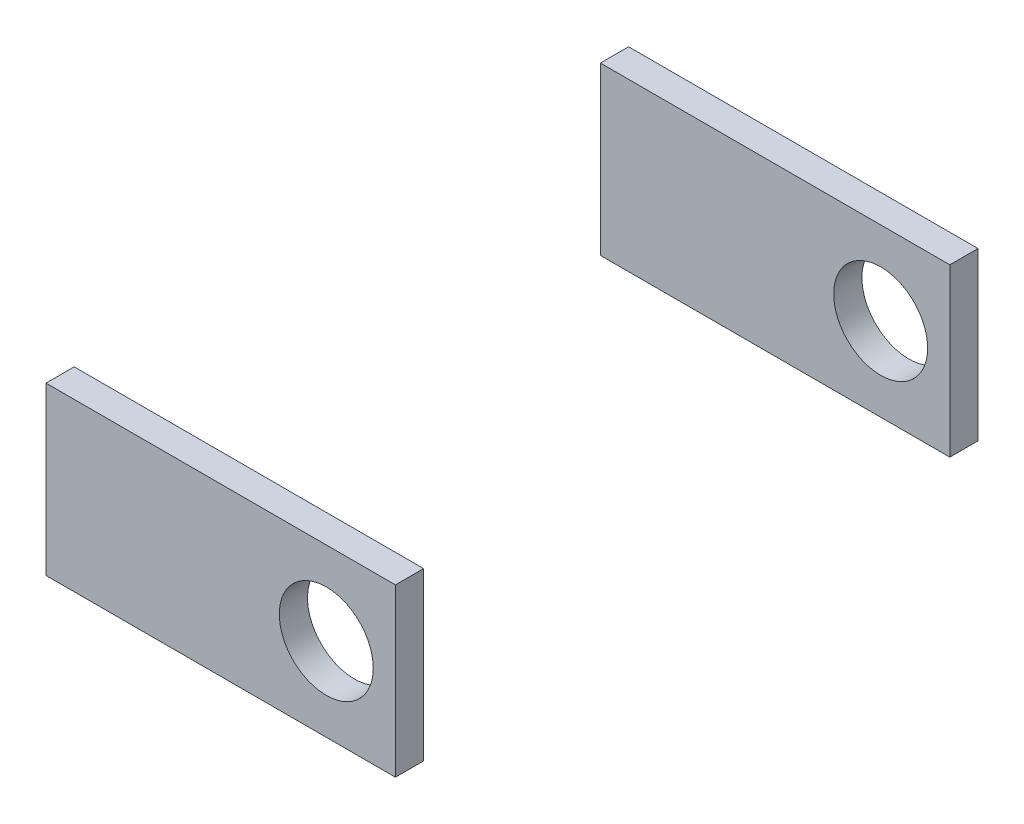
ISO-10303-21;
HEADER;
FILE_DESCRIPTION(('STEP AP214'),'2;1');
FILE_NAME('part.step','',(''),(''),'','','');
FILE_SCHEMA(('AUTOMOTIVE_DESIGN { 1 0 10303 214 1 1 1 1 }'));
ENDSEC;
DATA;
#1=APPLICATION_CONTEXT('core data for automotive mechanical design processes');
#2=APPLICATION_PROTOCOL_DEFINITION('international standard','automotive_design',2000,#1);
#3=PRODUCT_CONTEXT('',#1,'mechanical');
#4=PRODUCT('Part','Part','',(#3));
#5=PRODUCT_RELATED_PRODUCT_CATEGORY('part','',(#4));
#6=PRODUCT_DEFINITION_FORMATION('','',#4);
#7=PRODUCT_DEFINITION_CONTEXT('part definition',#1,'design');
#8=PRODUCT_DEFINITION('design','',#6,#7);
#9=PRODUCT_DEFINITION_SHAPE('','',#8);
#10=(LENGTH_UNIT() NAMED_UNIT(*) SI_UNIT(.MILLI.,.METRE.));
#11=(NAMED_UNIT(*) PLANE_ANGLE_UNIT() SI_UNIT($,.RADIAN.));
#12=(NAMED_UNIT(*) SI_UNIT($,.STERADIAN.) SOLID_ANGLE_UNIT());
#13=UNCERTAINTY_MEASURE_WITH_UNIT(LENGTH_MEASURE(1.E-05),#10,'distance_accuracy_value','');
#14=(GEOMETRIC_REPRESENTATION_CONTEXT(3) GLOBAL_UNCERTAINTY_ASSIGNED_CONTEXT((#13)) GLOBAL_UNIT_ASSIGNED_CONTEXT((#10,
#11,#12)) REPRESENTATION_CONTEXT('',''));
#15=CARTESIAN_POINT('',(0.,0.,0.));
#16=DIRECTION('',(0.,0.,1.));
#17=DIRECTION('',(1.,0.,0.));
#18=AXIS2_PLACEMENT_3D('',#15,#16,#17);
#19=CARTESIAN_POINT('',(40.,8.865220704011,70.2));
#20=DIRECTION('',(0.,1.,0.));
#21=DIRECTION('',(-1.,0.,0.));
#22=AXIS2_PLACEMENT_3D('',#19,#20,#21);
#23=PLANE('',#22);
#24=DIRECTION('',(-1.,0.,0.));
#25=VECTOR('',#24,1.);
#26=CARTESIAN_POINT('',(40.,8.86522070401099,70.2));
#27=LINE('',#26,#25);
#28=CARTESIAN_POINT('',(40.,8.865220704011,70.2));
#29=VERTEX_POINT('',#28);
#30=CARTESIAN_POINT('',(2.81236982140303,8.86522070401099,70.2));
#31=VERTEX_POINT('',#30);
#32=EDGE_CURVE('E94',#29,#31,#27,.T.);
#33=ORIENTED_EDGE('',*,*,#32,.T.);
#34=DIRECTION('',(0.,0.,1.));
#35=VECTOR('',#34,1.);
#36=CARTESIAN_POINT('',(2.81236982140303,8.86522070401099,0.));
#37=LINE('',#36,#35);
#38=CARTESIAN_POINT('',(2.81236982140303,8.86522070401099,73.2));
#39=VERTEX_POINT('',#38);
#40=EDGE_CURVE('E56',#31,#39,#37,.T.);
#41=ORIENTED_EDGE('',*,*,#40,.T.);
#42=DIRECTION('',(-1.,0.,0.));
#43=VECTOR('',#42,1.);
#44=CARTESIAN_POINT('',(40.,8.865220704011,73.2));
#45=LINE('',#44,#43);
#46=CARTESIAN_POINT('',(40.,8.865220704011,73.2));
#47=VERTEX_POINT('',#46);
#48=EDGE_CURVE('E61',#47,#39,#45,.T.);
#49=ORIENTED_EDGE('',*,*,#48,.F.);
#50=DIRECTION('',(0.,0.,1.));
#51=VECTOR('',#50,1.);
#52=CARTESIAN_POINT('',(40.,8.865220704011,70.2));
#53=LINE('',#52,#51);
#54=EDGE_CURVE('E120',#29,#47,#53,.T.);
#55=ORIENTED_EDGE('',*,*,#54,.F.);
#56=EDGE_LOOP('',(#33,#41,#49,#55));
#57=FACE_BOUND('',#56,.T.);
#58=ADVANCED_FACE('F53',(#57),#23,.T.);
#59=CARTESIAN_POINT('',(0.,-8.86522070401099,70.2));
#60=DIRECTION('',(0.,-1.,0.));
#61=DIRECTION('',(1.,0.,0.));
#62=AXIS2_PLACEMENT_3D('',#59,#60,#61);
#63=PLANE('',#62);
#64=DIRECTION('',(0.,0.,1.));
#65=VECTOR('',#64,1.);
#66=CARTESIAN_POINT('',(2.81236982140303,-8.86522070401099,0.));
#67=LINE('',#66,#65);
#68=CARTESIAN_POINT('',(2.81236982140303,-8.86522070401099,70.2));
#69=VERTEX_POINT('',#68);
#70=CARTESIAN_POINT('',(2.81236982140303,-8.86522070401099,73.2));
#71=VERTEX_POINT('',#70);
#72=EDGE_CURVE('E107',#69,#71,#67,.T.);
#73=ORIENTED_EDGE('',*,*,#72,.F.);
#74=DIRECTION('',(1.,0.,0.));
#75=VECTOR('',#74,1.);
#76=CARTESIAN_POINT('',(0.,-8.86522070401099,70.2));
#77=LINE('',#76,#75);
#78=CARTESIAN_POINT('',(40.,-8.865220704011,70.2));
#79=VERTEX_POINT('',#78);
#80=EDGE_CURVE('E73',#69,#79,#77,.T.);
#81=ORIENTED_EDGE('',*,*,#80,.T.);
#82=DIRECTION('',(0.,0.,1.));
#83=VECTOR('',#82,1.);
#84=CARTESIAN_POINT('',(40.,-8.865220704011,70.2));
#85=LINE('',#84,#83);
#86=CARTESIAN_POINT('',(40.,-8.865220704011,73.2));
#87=VERTEX_POINT('',#86);
#88=EDGE_CURVE('E114',#79,#87,#85,.T.);
#89=ORIENTED_EDGE('',*,*,#88,.T.);
#90=DIRECTION('',(1.,0.,0.));
#91=VECTOR('',#90,1.);
#92=CARTESIAN_POINT('',(0.,-8.86522070401099,73.2));
#93=LINE('',#92,#91);
#94=EDGE_CURVE('E119',#71,#87,#93,.T.);
#95=ORIENTED_EDGE('',*,*,#94,.F.);
#96=EDGE_LOOP('',(#73,#81,#89,#95));
#97=FACE_BOUND('',#96,.T.);
#98=ADVANCED_FACE('F131',(#97),#63,.T.);
#99=CARTESIAN_POINT('',(2.81236982140303,0.,0.));
#100=DIRECTION('',(1.,0.,0.));
#101=DIRECTION('',(0.,1.,0.));
#102=AXIS2_PLACEMENT_3D('',#99,#100,#101);
#103=PLANE('',#102);
#104=ORIENTED_EDGE('',*,*,#40,.F.);
#105=DIRECTION('',(0.,1.,0.));
#106=VECTOR('',#105,1.);
#107=CARTESIAN_POINT('',(2.81236982140303,-8.86522070401099,70.2));
#108=LINE('',#107,#106);
#109=EDGE_CURVE('E12',#69,#31,#108,.T.);
#110=ORIENTED_EDGE('',*,*,#109,.F.);
#111=ORIENTED_EDGE('',*,*,#72,.T.);
#112=DIRECTION('',(0.,1.,0.));
#113=VECTOR('',#112,1.);
#114=CARTESIAN_POINT('',(2.81236982140303,0.,73.2));
#115=LINE('',#114,#113);
#116=EDGE_CURVE('E101',#71,#39,#115,.T.);
#117=ORIENTED_EDGE('',*,*,#116,.T.);
#118=EDGE_LOOP('',(#104,#110,#111,#117));
#119=FACE_BOUND('',#118,.T.);
#120=ADVANCED_FACE('F105',(#119),#103,.F.);
#121=CARTESIAN_POINT('',(32.6400394511442,0.,70.2));
#122=DIRECTION('',(0.,0.,1.));
#123=DIRECTION('',(1.,0.,0.));
#124=AXIS2_PLACEMENT_3D('',#121,#122,#123);
#125=CYLINDRICAL_SURFACE('',#124,5.);
#126=CARTESIAN_POINT('',(32.6400394511442,0.,70.2));
#127=DIRECTION('',(0.,0.,1.));
#128=DIRECTION('',(1.,0.,0.));
#129=AXIS2_PLACEMENT_3D('',#126,#127,#128);
#130=CIRCLE('',#129,5.);
#131=CARTESIAN_POINT('',(37.6400394511441,0.,70.2));
#132=VERTEX_POINT('',#131);
#133=EDGE_CURVE('E117',#132,#132,#130,.T.);
#134=ORIENTED_EDGE('',*,*,#133,.F.);
#135=EDGE_LOOP('',(#134));
#136=FACE_BOUND('',#135,.T.);
#137=CARTESIAN_POINT('',(32.6400394511442,0.,73.2));
#138=DIRECTION('',(0.,0.,1.));
#139=DIRECTION('',(1.,0.,0.));
#140=AXIS2_PLACEMENT_3D('',#137,#138,#139);
#141=CIRCLE('',#140,5.);
#142=CARTESIAN_POINT('',(37.6400394511441,0.,73.2));
#143=VERTEX_POINT('',#142);
#144=EDGE_CURVE('E109',#143,#143,#141,.T.);
#145=ORIENTED_EDGE('',*,*,#144,.T.);
#146=EDGE_LOOP('',(#145));
#147=FACE_BOUND('',#146,.T.);
#148=ADVANCED_FACE('F140',(#136,#147),#125,.F.);
#149=CARTESIAN_POINT('',(40.,-8.865220704011,70.2));
#150=DIRECTION('',(1.,0.,0.));
#151=DIRECTION('',(0.,0.,-1.));
#152=AXIS2_PLACEMENT_3D('',#149,#150,#151);
#153=PLANE('',#152);
#154=DIRECTION('',(0.,1.,0.));
#155=VECTOR('',#154,1.);
#156=CARTESIAN_POINT('',(40.,-8.865220704011,73.2));
#157=LINE('',#156,#155);
#158=EDGE_CURVE('E103',#87,#47,#157,.T.);
#159=ORIENTED_EDGE('',*,*,#158,.F.);
#160=ORIENTED_EDGE('',*,*,#88,.F.);
#161=DIRECTION('',(0.,1.,0.));
#162=VECTOR('',#161,1.);
#163=CARTESIAN_POINT('',(40.,-8.865220704011,70.2));
#164=LINE('',#163,#162);
#165=EDGE_CURVE('E112',#79,#29,#164,.T.);
#166=ORIENTED_EDGE('',*,*,#165,.T.);
#167=ORIENTED_EDGE('',*,*,#54,.T.);
#168=EDGE_LOOP('',(#159,#160,#166,#167));
#169=FACE_BOUND('',#168,.T.);
#170=ADVANCED_FACE('F133',(#169),#153,.T.);
#171=CARTESIAN_POINT('',(0.,0.,70.2));
#172=DIRECTION('',(0.,0.,1.));
#173=DIRECTION('',(1.,0.,0.));
#174=AXIS2_PLACEMENT_3D('',#171,#172,#173);
#175=PLANE('',#174);
#176=ORIENTED_EDGE('',*,*,#80,.F.);
#177=ORIENTED_EDGE('',*,*,#109,.T.);
#178=ORIENTED_EDGE('',*,*,#32,.F.);
#179=ORIENTED_EDGE('',*,*,#165,.F.);
#180=EDGE_LOOP('',(#176,#177,#178,#179));
#181=FACE_BOUND('',#180,.T.);
#182=ORIENTED_EDGE('',*,*,#133,.T.);
#183=EDGE_LOOP('',(#182));
#184=FACE_BOUND('',#183,.T.);
#185=ADVANCED_FACE('F134',(#181,#184),#175,.F.);
#186=CARTESIAN_POINT('',(0.,0.,73.2));
#187=DIRECTION('',(0.,0.,1.));
#188=DIRECTION('',(1.,0.,0.));
#189=AXIS2_PLACEMENT_3D('',#186,#187,#188);
#190=PLANE('',#189);
#191=ORIENTED_EDGE('',*,*,#116,.F.);
#192=ORIENTED_EDGE('',*,*,#94,.T.);
#193=ORIENTED_EDGE('',*,*,#158,.T.);
#194=ORIENTED_EDGE('',*,*,#48,.T.);
#195=EDGE_LOOP('',(#191,#192,#193,#194));
#196=FACE_BOUND('',#195,.T.);
#197=ORIENTED_EDGE('',*,*,#144,.F.);
#198=EDGE_LOOP('',(#197));
#199=FACE_BOUND('',#198,.T.);
#200=ADVANCED_FACE('F99',(#196,#199),#190,.T.);
#201=CLOSED_SHELL('',(#58,#98,#120,#148,#170,#185,#200));
#202=MANIFOLD_SOLID_BREP('B2',#201);
#203=CARTESIAN_POINT('',(32.6400394511442,0.,11.2));
#204=DIRECTION('',(0.,0.,1.));
#205=DIRECTION('',(1.,0.,0.));
#206=AXIS2_PLACEMENT_3D('',#203,#204,#205);
#207=CYLINDRICAL_SURFACE('',#206,5.);
#208=CARTESIAN_POINT('',(32.6400394511442,0.,11.2));
#209=DIRECTION('',(0.,0.,1.));
#210=DIRECTION('',(1.,0.,0.));
#211=AXIS2_PLACEMENT_3D('',#208,#209,#210);
#212=CIRCLE('',#211,5.);
#213=CARTESIAN_POINT('',(37.6400394511441,0.,11.2));
#214=VERTEX_POINT('',#213);
#215=EDGE_CURVE('E276',#214,#214,#212,.T.);
#216=ORIENTED_EDGE('',*,*,#215,.F.);
#217=EDGE_LOOP('',(#216));
#218=FACE_BOUND('',#217,.T.);
#219=CARTESIAN_POINT('',(32.6400394511442,0.,14.2));
#220=DIRECTION('',(0.,0.,1.));
#221=DIRECTION('',(1.,0.,0.));
#222=AXIS2_PLACEMENT_3D('',#219,#220,#221);
#223=CIRCLE('',#222,5.);
#224=CARTESIAN_POINT('',(37.6400394511441,0.,14.2));
#225=VERTEX_POINT('',#224);
#226=EDGE_CURVE('E289',#225,#225,#223,.T.);
#227=ORIENTED_EDGE('',*,*,#226,.T.);
#228=EDGE_LOOP('',(#227));
#229=FACE_BOUND('',#228,.T.);
#230=ADVANCED_FACE('F232',(#218,#229),#207,.F.);
#231=CARTESIAN_POINT('',(40.,-8.865220704011,11.2));
#232=DIRECTION('',(1.,0.,0.));
#233=DIRECTION('',(0.,0.,-1.));
#234=AXIS2_PLACEMENT_3D('',#231,#232,#233);
#235=PLANE('',#234);
#236=DIRECTION('',(0.,1.,0.));
#237=VECTOR('',#236,1.);
#238=CARTESIAN_POINT('',(40.,-8.865220704011,14.2));
#239=LINE('',#238,#237);
#240=CARTESIAN_POINT('',(40.,-8.865220704011,14.2));
#241=VERTEX_POINT('',#240);
#242=CARTESIAN_POINT('',(40.,8.865220704011,14.2));
#243=VERTEX_POINT('',#242);
#244=EDGE_CURVE('E268',#241,#243,#239,.T.);
#245=ORIENTED_EDGE('',*,*,#244,.F.);
#246=DIRECTION('',(0.,0.,1.));
#247=VECTOR('',#246,1.);
#248=CARTESIAN_POINT('',(40.,-8.865220704011,11.2));
#249=LINE('',#248,#247);
#250=CARTESIAN_POINT('',(40.,-8.865220704011,11.2));
#251=VERTEX_POINT('',#250);
#252=EDGE_CURVE('E236',#251,#241,#249,.T.);
#253=ORIENTED_EDGE('',*,*,#252,.F.);
#254=DIRECTION('',(0.,1.,0.));
#255=VECTOR('',#254,1.);
#256=CARTESIAN_POINT('',(40.,-8.865220704011,11.2));
#257=LINE('',#256,#255);
#258=CARTESIAN_POINT('',(40.,8.865220704011,11.2));
#259=VERTEX_POINT('',#258);
#260=EDGE_CURVE('E270',#251,#259,#257,.T.);
#261=ORIENTED_EDGE('',*,*,#260,.T.);
#262=DIRECTION('',(0.,0.,1.));
#263=VECTOR('',#262,1.);
#264=CARTESIAN_POINT('',(40.,8.865220704011,11.2));
#265=LINE('',#264,#263);
#266=EDGE_CURVE('E51',#259,#243,#265,.T.);
#267=ORIENTED_EDGE('',*,*,#266,.T.);
#268=EDGE_LOOP('',(#245,#253,#261,#267));
#269=FACE_BOUND('',#268,.T.);
#270=ADVANCED_FACE('F266',(#269),#235,.T.);
#271=CARTESIAN_POINT('',(0.,0.,11.2));
#272=DIRECTION('',(0.,0.,1.));
#273=DIRECTION('',(1.,0.,0.));
#274=AXIS2_PLACEMENT_3D('',#271,#272,#273);
#275=PLANE('',#274);
#276=DIRECTION('',(1.,0.,0.));
#277=VECTOR('',#276,1.);
#278=CARTESIAN_POINT('',(0.,-8.86522070401099,11.2));
#279=LINE('',#278,#277);
#280=CARTESIAN_POINT('',(2.81236982140303,-8.86522070401099,11.2));
#281=VERTEX_POINT('',#280);
#282=EDGE_CURVE('E283',#281,#251,#279,.T.);
#283=ORIENTED_EDGE('',*,*,#282,.F.);
#284=DIRECTION('',(0.,1.,0.));
#285=VECTOR('',#284,1.);
#286=CARTESIAN_POINT('',(2.81236982140303,0.,11.2));
#287=LINE('',#286,#285);
#288=CARTESIAN_POINT('',(2.81236982140303,8.86522070401099,11.2));
#289=VERTEX_POINT('',#288);
#290=EDGE_CURVE('E292',#281,#289,#287,.T.);
#291=ORIENTED_EDGE('',*,*,#290,.T.);
#292=DIRECTION('',(-1.,0.,0.));
#293=VECTOR('',#292,1.);
#294=CARTESIAN_POINT('',(40.,8.865220704011,11.2));
#295=LINE('',#294,#293);
#296=EDGE_CURVE('E281',#259,#289,#295,.T.);
#297=ORIENTED_EDGE('',*,*,#296,.F.);
#298=ORIENTED_EDGE('',*,*,#260,.F.);
#299=EDGE_LOOP('',(#283,#291,#297,#298));
#300=FACE_BOUND('',#299,.T.);
#301=ORIENTED_EDGE('',*,*,#215,.T.);
#302=EDGE_LOOP('',(#301));
#303=FACE_BOUND('',#302,.T.);
#304=ADVANCED_FACE('F234',(#300,#303),#275,.F.);
#305=CARTESIAN_POINT('',(2.81236982140303,0.,0.));
#306=DIRECTION('',(1.,0.,0.));
#307=DIRECTION('',(0.,1.,0.));
#308=AXIS2_PLACEMENT_3D('',#305,#306,#307);
#309=PLANE('',#308);
#310=DIRECTION('',(0.,0.,1.));
#311=VECTOR('',#310,1.);
#312=CARTESIAN_POINT('',(2.81236982140303,-8.86522070401099,0.));
#313=LINE('',#312,#311);
#314=CARTESIAN_POINT('',(2.81236982140303,-8.86522070401099,14.2));
#315=VERTEX_POINT('',#314);
#316=EDGE_CURVE('E297',#281,#315,#313,.T.);
#317=ORIENTED_EDGE('',*,*,#316,.T.);
#318=DIRECTION('',(0.,-1.,0.));
#319=VECTOR('',#318,1.);
#320=CARTESIAN_POINT('',(2.81236982140303,8.86522070401099,14.2));
#321=LINE('',#320,#319);
#322=CARTESIAN_POINT('',(2.81236982140303,8.86522070401099,14.2));
#323=VERTEX_POINT('',#322);
#324=EDGE_CURVE('E299',#323,#315,#321,.T.);
#325=ORIENTED_EDGE('',*,*,#324,.F.);
#326=DIRECTION('',(0.,0.,1.));
#327=VECTOR('',#326,1.);
#328=CARTESIAN_POINT('',(2.81236982140303,8.86522070401099,0.));
#329=LINE('',#328,#327);
#330=EDGE_CURVE('E274',#289,#323,#329,.T.);
#331=ORIENTED_EDGE('',*,*,#330,.F.);
#332=ORIENTED_EDGE('',*,*,#290,.F.);
#333=EDGE_LOOP('',(#317,#325,#331,#332));
#334=FACE_BOUND('',#333,.T.);
#335=ADVANCED_FACE('F308',(#334),#309,.F.);
#336=CARTESIAN_POINT('',(0.,-8.86522070401099,70.2));
#337=DIRECTION('',(0.,-1.,0.));
#338=DIRECTION('',(1.,0.,0.));
#339=AXIS2_PLACEMENT_3D('',#336,#337,#338);
#340=PLANE('',#339);
#341=DIRECTION('',(1.,0.,0.));
#342=VECTOR('',#341,1.);
#343=CARTESIAN_POINT('',(0.,-8.86522070401099,14.2));
#344=LINE('',#343,#342);
#345=EDGE_CURVE('E275',#315,#241,#344,.T.);
#346=ORIENTED_EDGE('',*,*,#345,.F.);
#347=ORIENTED_EDGE('',*,*,#316,.F.);
#348=ORIENTED_EDGE('',*,*,#282,.T.);
#349=ORIENTED_EDGE('',*,*,#252,.T.);
#350=EDGE_LOOP('',(#346,#347,#348,#349));
#351=FACE_BOUND('',#350,.T.);
#352=ADVANCED_FACE('F310',(#351),#340,.T.);
#353=CARTESIAN_POINT('',(40.,8.865220704011,70.2));
#354=DIRECTION('',(0.,1.,0.));
#355=DIRECTION('',(-1.,0.,0.));
#356=AXIS2_PLACEMENT_3D('',#353,#354,#355);
#357=PLANE('',#356);
#358=ORIENTED_EDGE('',*,*,#330,.T.);
#359=DIRECTION('',(-1.,0.,0.));
#360=VECTOR('',#359,1.);
#361=CARTESIAN_POINT('',(40.,8.865220704011,14.2));
#362=LINE('',#361,#360);
#363=EDGE_CURVE('E247',#243,#323,#362,.T.);
#364=ORIENTED_EDGE('',*,*,#363,.F.);
#365=ORIENTED_EDGE('',*,*,#266,.F.);
#366=ORIENTED_EDGE('',*,*,#296,.T.);
#367=EDGE_LOOP('',(#358,#364,#365,#366));
#368=FACE_BOUND('',#367,.T.);
#369=ADVANCED_FACE('F272',(#368),#357,.T.);
#370=CARTESIAN_POINT('',(0.,0.,14.2));
#371=DIRECTION('',(0.,0.,1.));
#372=DIRECTION('',(1.,0.,0.));
#373=AXIS2_PLACEMENT_3D('',#370,#371,#372);
#374=PLANE('',#373);
#375=ORIENTED_EDGE('',*,*,#226,.F.);
#376=EDGE_LOOP('',(#375));
#377=FACE_BOUND('',#376,.T.);
#378=ORIENTED_EDGE('',*,*,#363,.T.);
#379=ORIENTED_EDGE('',*,*,#324,.T.);
#380=ORIENTED_EDGE('',*,*,#345,.T.);
#381=ORIENTED_EDGE('',*,*,#244,.T.);
#382=EDGE_LOOP('',(#378,#379,#380,#381));
#383=FACE_BOUND('',#382,.T.);
#384=ADVANCED_FACE('F278',(#377,#383),#374,.T.);
#385=CLOSED_SHELL('',(#230,#270,#304,#335,#352,#369,#384));
#386=MANIFOLD_SOLID_BREP('B6',#385);
#387=ADVANCED_BREP_SHAPE_REPRESENTATION('',(#18,#202,#386),#14);
#388=SHAPE_DEFINITION_REPRESENTATION(#9,#387);
ENDSEC;
END-ISO-10303-21;
